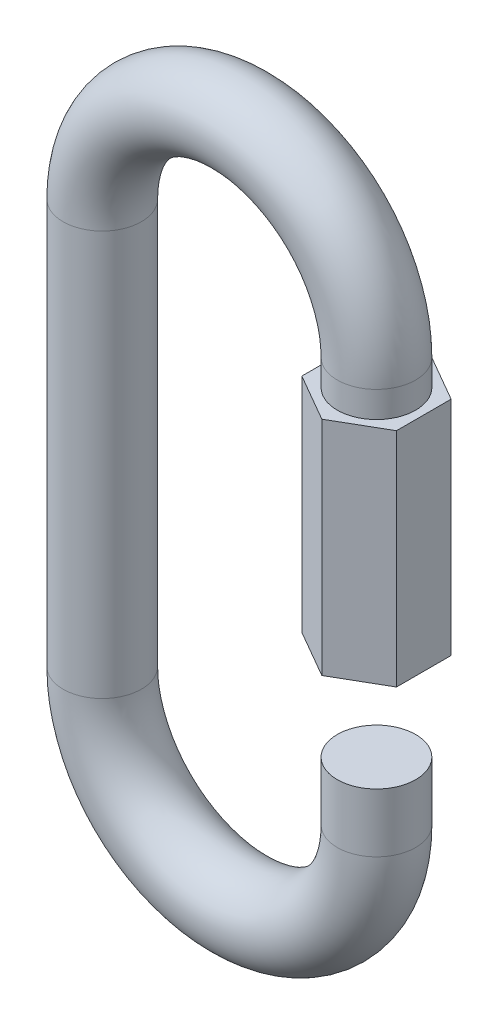
ISO-10303-21;
HEADER;
FILE_DESCRIPTION(('STEP AP214'),'2;1');
FILE_NAME('part.step','',(''),(''),'','','');
FILE_SCHEMA(('AUTOMOTIVE_DESIGN { 1 0 10303 214 1 1 1 1 }'));
ENDSEC;
DATA;
#1=APPLICATION_CONTEXT('core data for automotive mechanical design processes');
#2=APPLICATION_PROTOCOL_DEFINITION('international standard','automotive_design',2000,#1);
#3=PRODUCT_CONTEXT('',#1,'mechanical');
#4=PRODUCT('Part','Part','',(#3));
#5=PRODUCT_RELATED_PRODUCT_CATEGORY('part','',(#4));
#6=PRODUCT_DEFINITION_FORMATION('','',#4);
#7=PRODUCT_DEFINITION_CONTEXT('part definition',#1,'design');
#8=PRODUCT_DEFINITION('design','',#6,#7);
#9=PRODUCT_DEFINITION_SHAPE('','',#8);
#10=(LENGTH_UNIT() NAMED_UNIT(*) SI_UNIT(.MILLI.,.METRE.));
#11=(NAMED_UNIT(*) PLANE_ANGLE_UNIT() SI_UNIT($,.RADIAN.));
#12=(NAMED_UNIT(*) SI_UNIT($,.STERADIAN.) SOLID_ANGLE_UNIT());
#13=UNCERTAINTY_MEASURE_WITH_UNIT(LENGTH_MEASURE(1.E-05),#10,'distance_accuracy_value','');
#14=(GEOMETRIC_REPRESENTATION_CONTEXT(3) GLOBAL_UNCERTAINTY_ASSIGNED_CONTEXT((#13)) GLOBAL_UNIT_ASSIGNED_CONTEXT((#10,
#11,#12)) REPRESENTATION_CONTEXT('',''));
#15=CARTESIAN_POINT('',(0.,0.,0.));
#16=DIRECTION('',(0.,0.,1.));
#17=DIRECTION('',(1.,0.,0.));
#18=AXIS2_PLACEMENT_3D('',#15,#16,#17);
#19=CARTESIAN_POINT('',(0.,0.,0.));
#20=DIRECTION('',(0.,1.,0.));
#21=DIRECTION('',(-1.,0.,0.));
#22=AXIS2_PLACEMENT_3D('',#19,#20,#21);
#23=CYLINDRICAL_SURFACE('',#22,3.);
#24=CARTESIAN_POINT('',(0.,19.,0.));
#25=DIRECTION('',(0.,1.,0.));
#26=DIRECTION('',(0.,0.,1.));
#27=AXIS2_PLACEMENT_3D('',#24,#25,#26);
#28=CIRCLE('',#27,3.);
#29=CARTESIAN_POINT('',(2.99999999999999,19.,0.));
#30=VERTEX_POINT('',#29);
#31=EDGE_CURVE('E167',#30,#30,#28,.T.);
#32=ORIENTED_EDGE('',*,*,#31,.F.);
#33=EDGE_LOOP('',(#32));
#34=FACE_BOUND('',#33,.T.);
#35=CARTESIAN_POINT('',(0.,17.,0.));
#36=DIRECTION('',(0.,-1.,0.));
#37=DIRECTION('',(0.,0.,-1.));
#38=AXIS2_PLACEMENT_3D('',#35,#36,#37);
#39=CIRCLE('',#38,3.);
#40=CARTESIAN_POINT('',(0.,17.,-3.));
#41=VERTEX_POINT('',#40);
#42=EDGE_CURVE('E43',#41,#41,#39,.F.);
#43=ORIENTED_EDGE('',*,*,#42,.T.);
#44=EDGE_LOOP('',(#43));
#45=FACE_BOUND('',#44,.T.);
#46=ADVANCED_FACE('F39',(#34,#45),#23,.T.);
#47=CARTESIAN_POINT('',(0.,-7.5,0.));
#48=DIRECTION('',(0.,1.,0.));
#49=DIRECTION('',(0.,0.,1.));
#50=AXIS2_PLACEMENT_3D('',#47,#48,#49);
#51=PLANE('',#50);
#52=CARTESIAN_POINT('',(0.,-7.5,0.));
#53=DIRECTION('',(0.,1.,0.));
#54=DIRECTION('',(0.,0.,1.));
#55=AXIS2_PLACEMENT_3D('',#52,#53,#54);
#56=CIRCLE('',#55,3.);
#57=CARTESIAN_POINT('',(0.,-7.5,3.));
#58=VERTEX_POINT('',#57);
#59=EDGE_CURVE('E11',#58,#58,#56,.T.);
#60=ORIENTED_EDGE('',*,*,#59,.T.);
#61=EDGE_LOOP('',(#60));
#62=FACE_BOUND('',#61,.T.);
#63=ADVANCED_FACE('F200',(#62),#51,.T.);
#64=CARTESIAN_POINT('',(-10.5,19.,0.));
#65=DIRECTION('',(0.,0.,1.));
#66=DIRECTION('',(1.,0.,0.));
#67=AXIS2_PLACEMENT_3D('',#64,#65,#66);
#68=TOROIDAL_SURFACE('',#67,10.5,3.);
#69=CARTESIAN_POINT('',(-21.,19.,0.));
#70=DIRECTION('',(0.,-1.,0.));
#71=DIRECTION('',(0.,0.,1.));
#72=AXIS2_PLACEMENT_3D('',#69,#70,#71);
#73=CIRCLE('',#72,3.);
#74=CARTESIAN_POINT('',(-24.,19.,0.));
#75=VERTEX_POINT('',#74);
#76=EDGE_CURVE('E171',#75,#75,#73,.T.);
#77=CARTESIAN_POINT('',(-10.5,19.,0.));
#78=DIRECTION('',(0.,0.,1.));
#79=DIRECTION('',(1.,0.,0.));
#80=AXIS2_PLACEMENT_3D('',#77,#78,#79);
#81=CIRCLE('',#80,13.5);
#82=EDGE_CURVE('',#30,#75,#81,.T.);
#83=ORIENTED_EDGE('',*,*,#31,.T.);
#84=ORIENTED_EDGE('',*,*,#76,.F.);
#85=ORIENTED_EDGE('',*,*,#82,.T.);
#86=ORIENTED_EDGE('',*,*,#82,.F.);
#87=EDGE_LOOP('',(#83,#85,#84,#86));
#88=FACE_BOUND('',#87,.T.);
#89=ADVANCED_FACE('F194',(#88),#68,.T.);
#90=CARTESIAN_POINT('',(-21.,19.,0.));
#91=DIRECTION('',(0.,-1.,0.));
#92=DIRECTION('',(1.,0.,0.));
#93=AXIS2_PLACEMENT_3D('',#90,#91,#92);
#94=CYLINDRICAL_SURFACE('',#93,3.);
#95=CARTESIAN_POINT('',(-21.,-12.,0.));
#96=DIRECTION('',(0.,-1.,0.));
#97=DIRECTION('',(0.,0.,1.));
#98=AXIS2_PLACEMENT_3D('',#95,#96,#97);
#99=CIRCLE('',#98,3.);
#100=CARTESIAN_POINT('',(-24.,-12.,0.));
#101=VERTEX_POINT('',#100);
#102=EDGE_CURVE('E175',#101,#101,#99,.T.);
#103=ORIENTED_EDGE('',*,*,#102,.F.);
#104=EDGE_LOOP('',(#103));
#105=FACE_BOUND('',#104,.T.);
#106=ORIENTED_EDGE('',*,*,#76,.T.);
#107=EDGE_LOOP('',(#106));
#108=FACE_BOUND('',#107,.T.);
#109=ADVANCED_FACE('F188',(#105,#108),#94,.T.);
#110=CARTESIAN_POINT('',(-10.5,-12.,0.));
#111=DIRECTION('',(0.,0.,1.));
#112=DIRECTION('',(1.,0.,0.));
#113=AXIS2_PLACEMENT_3D('',#110,#111,#112);
#114=TOROIDAL_SURFACE('',#113,10.5,3.);
#115=CARTESIAN_POINT('',(0.,-12.,0.));
#116=DIRECTION('',(0.,1.,0.));
#117=DIRECTION('',(0.,0.,1.));
#118=AXIS2_PLACEMENT_3D('',#115,#116,#117);
#119=CIRCLE('',#118,3.);
#120=CARTESIAN_POINT('',(3.00000000000002,-12.,0.));
#121=VERTEX_POINT('',#120);
#122=EDGE_CURVE('E50',#121,#121,#119,.T.);
#123=CARTESIAN_POINT('',(-10.5,-12.,0.));
#124=DIRECTION('',(0.,0.,1.));
#125=DIRECTION('',(1.,0.,0.));
#126=AXIS2_PLACEMENT_3D('',#123,#124,#125);
#127=CIRCLE('',#126,13.5);
#128=EDGE_CURVE('',#101,#121,#127,.T.);
#129=ORIENTED_EDGE('',*,*,#102,.T.);
#130=ORIENTED_EDGE('',*,*,#122,.F.);
#131=ORIENTED_EDGE('',*,*,#128,.T.);
#132=ORIENTED_EDGE('',*,*,#128,.F.);
#133=EDGE_LOOP('',(#129,#131,#130,#132));
#134=FACE_BOUND('',#133,.T.);
#135=ADVANCED_FACE('F185',(#134),#114,.T.);
#136=CARTESIAN_POINT('',(0.,-12.,0.));
#137=DIRECTION('',(0.,1.,0.));
#138=DIRECTION('',(-1.,0.,0.));
#139=AXIS2_PLACEMENT_3D('',#136,#137,#138);
#140=CYLINDRICAL_SURFACE('',#139,3.);
#141=ORIENTED_EDGE('',*,*,#59,.F.);
#142=EDGE_LOOP('',(#141));
#143=FACE_BOUND('',#142,.T.);
#144=ORIENTED_EDGE('',*,*,#122,.T.);
#145=EDGE_LOOP('',(#144));
#146=FACE_BOUND('',#145,.T.);
#147=ADVANCED_FACE('F183',(#143,#146),#140,.T.);
#148=CARTESIAN_POINT('',(3.62330407200812,17.,-2.09191558132975));
#149=DIRECTION('',(1.,0.,0.));
#150=DIRECTION('',(0.,0.,-1.));
#151=AXIS2_PLACEMENT_3D('',#148,#149,#150);
#152=PLANE('',#151);
#153=DIRECTION('',(0.,0.,1.));
#154=VECTOR('',#153,1.);
#155=CARTESIAN_POINT('',(3.62330407200812,0.,-2.09191558132975));
#156=LINE('',#155,#154);
#157=CARTESIAN_POINT('',(3.62330407200812,0.,-2.09191558132975));
#158=VERTEX_POINT('',#157);
#159=CARTESIAN_POINT('',(3.62330407200812,0.,2.09191558132975));
#160=VERTEX_POINT('',#159);
#161=EDGE_CURVE('E134',#158,#160,#156,.T.);
#162=ORIENTED_EDGE('',*,*,#161,.F.);
#163=DIRECTION('',(0.,-1.,0.));
#164=VECTOR('',#163,1.);
#165=CARTESIAN_POINT('',(3.62330407200812,17.,-2.09191558132975));
#166=LINE('',#165,#164);
#167=CARTESIAN_POINT('',(3.62330407200812,17.,-2.09191558132975));
#168=VERTEX_POINT('',#167);
#169=EDGE_CURVE('E58',#168,#158,#166,.T.);
#170=ORIENTED_EDGE('',*,*,#169,.F.);
#171=DIRECTION('',(0.,0.,1.));
#172=VECTOR('',#171,1.);
#173=CARTESIAN_POINT('',(3.62330407200812,17.,-2.09191558132975));
#174=LINE('',#173,#172);
#175=CARTESIAN_POINT('',(3.62330407200812,17.,2.09191558132975));
#176=VERTEX_POINT('',#175);
#177=EDGE_CURVE('E155',#168,#176,#174,.T.);
#178=ORIENTED_EDGE('',*,*,#177,.T.);
#179=DIRECTION('',(0.,-1.,0.));
#180=VECTOR('',#179,1.);
#181=CARTESIAN_POINT('',(3.62330407200812,17.,2.09191558132975));
#182=LINE('',#181,#180);
#183=EDGE_CURVE('E93',#176,#160,#182,.T.);
#184=ORIENTED_EDGE('',*,*,#183,.T.);
#185=EDGE_LOOP('',(#162,#170,#178,#184));
#186=FACE_BOUND('',#185,.T.);
#187=ADVANCED_FACE('F225',(#186),#152,.T.);
#188=CARTESIAN_POINT('',(0.,17.,-4.18383116265951));
#189=DIRECTION('',(0.5,0.,-0.866025403784439));
#190=DIRECTION('',(-0.866025403784439,0.,-0.5));
#191=AXIS2_PLACEMENT_3D('',#188,#189,#190);
#192=PLANE('',#191);
#193=DIRECTION('',(0.866025403784439,0.,0.5));
#194=VECTOR('',#193,1.);
#195=CARTESIAN_POINT('',(0.,0.,-4.18383116265951));
#196=LINE('',#195,#194);
#197=CARTESIAN_POINT('',(0.,0.,-4.18383116265951));
#198=VERTEX_POINT('',#197);
#199=EDGE_CURVE('E151',#198,#158,#196,.T.);
#200=ORIENTED_EDGE('',*,*,#199,.F.);
#201=DIRECTION('',(0.,-1.,0.));
#202=VECTOR('',#201,1.);
#203=CARTESIAN_POINT('',(0.,17.,-4.18383116265951));
#204=LINE('',#203,#202);
#205=CARTESIAN_POINT('',(0.,17.,-4.18383116265951));
#206=VERTEX_POINT('',#205);
#207=EDGE_CURVE('E81',#206,#198,#204,.T.);
#208=ORIENTED_EDGE('',*,*,#207,.F.);
#209=DIRECTION('',(0.866025403784439,0.,0.5));
#210=VECTOR('',#209,1.);
#211=CARTESIAN_POINT('',(0.,17.,-4.18383116265951));
#212=LINE('',#211,#210);
#213=EDGE_CURVE('E120',#206,#168,#212,.T.);
#214=ORIENTED_EDGE('',*,*,#213,.T.);
#215=ORIENTED_EDGE('',*,*,#169,.T.);
#216=EDGE_LOOP('',(#200,#208,#214,#215));
#217=FACE_BOUND('',#216,.T.);
#218=ADVANCED_FACE('F222',(#217),#192,.T.);
#219=CARTESIAN_POINT('',(-3.62330407200812,17.,-2.09191558132975));
#220=DIRECTION('',(-0.5,0.,-0.866025403784439));
#221=DIRECTION('',(-0.866025403784439,0.,0.5));
#222=AXIS2_PLACEMENT_3D('',#219,#220,#221);
#223=PLANE('',#222);
#224=DIRECTION('',(0.866025403784439,0.,-0.5));
#225=VECTOR('',#224,1.);
#226=CARTESIAN_POINT('',(-3.62330407200812,0.,-2.09191558132975));
#227=LINE('',#226,#225);
#228=CARTESIAN_POINT('',(-3.62330407200812,0.,-2.09191558132975));
#229=VERTEX_POINT('',#228);
#230=EDGE_CURVE('E106',#229,#198,#227,.T.);
#231=ORIENTED_EDGE('',*,*,#230,.F.);
#232=DIRECTION('',(0.,-1.,0.));
#233=VECTOR('',#232,1.);
#234=CARTESIAN_POINT('',(-3.62330407200812,17.,-2.09191558132975));
#235=LINE('',#234,#233);
#236=CARTESIAN_POINT('',(-3.62330407200812,17.,-2.09191558132975));
#237=VERTEX_POINT('',#236);
#238=EDGE_CURVE('E101',#237,#229,#235,.T.);
#239=ORIENTED_EDGE('',*,*,#238,.F.);
#240=DIRECTION('',(0.866025403784439,0.,-0.5));
#241=VECTOR('',#240,1.);
#242=CARTESIAN_POINT('',(-3.62330407200812,17.,-2.09191558132975));
#243=LINE('',#242,#241);
#244=EDGE_CURVE('E104',#237,#206,#243,.T.);
#245=ORIENTED_EDGE('',*,*,#244,.T.);
#246=ORIENTED_EDGE('',*,*,#207,.T.);
#247=EDGE_LOOP('',(#231,#239,#245,#246));
#248=FACE_BOUND('',#247,.T.);
#249=ADVANCED_FACE('F103',(#248),#223,.T.);
#250=CARTESIAN_POINT('',(-3.62330407200812,17.,2.09191558132976));
#251=DIRECTION('',(-1.,0.,0.));
#252=DIRECTION('',(0.,0.,1.));
#253=AXIS2_PLACEMENT_3D('',#250,#251,#252);
#254=PLANE('',#253);
#255=DIRECTION('',(0.,0.,-1.));
#256=VECTOR('',#255,1.);
#257=CARTESIAN_POINT('',(-3.62330407200812,0.,2.09191558132976));
#258=LINE('',#257,#256);
#259=CARTESIAN_POINT('',(-3.62330407200812,0.,2.09191558132976));
#260=VERTEX_POINT('',#259);
#261=EDGE_CURVE('E146',#260,#229,#258,.T.);
#262=ORIENTED_EDGE('',*,*,#261,.F.);
#263=DIRECTION('',(0.,-1.,0.));
#264=VECTOR('',#263,1.);
#265=CARTESIAN_POINT('',(-3.62330407200812,17.,2.09191558132976));
#266=LINE('',#265,#264);
#267=CARTESIAN_POINT('',(-3.62330407200812,17.,2.09191558132976));
#268=VERTEX_POINT('',#267);
#269=EDGE_CURVE('E112',#268,#260,#266,.T.);
#270=ORIENTED_EDGE('',*,*,#269,.F.);
#271=DIRECTION('',(0.,0.,-1.));
#272=VECTOR('',#271,1.);
#273=CARTESIAN_POINT('',(-3.62330407200812,17.,2.09191558132976));
#274=LINE('',#273,#272);
#275=EDGE_CURVE('E118',#268,#237,#274,.T.);
#276=ORIENTED_EDGE('',*,*,#275,.T.);
#277=ORIENTED_EDGE('',*,*,#238,.T.);
#278=EDGE_LOOP('',(#262,#270,#276,#277));
#279=FACE_BOUND('',#278,.T.);
#280=ADVANCED_FACE('F123',(#279),#254,.T.);
#281=CARTESIAN_POINT('',(0.,17.,4.18383116265951));
#282=DIRECTION('',(-0.5,0.,0.866025403784439));
#283=DIRECTION('',(0.866025403784439,0.,0.5));
#284=AXIS2_PLACEMENT_3D('',#281,#282,#283);
#285=PLANE('',#284);
#286=DIRECTION('',(-0.866025403784439,0.,-0.5));
#287=VECTOR('',#286,1.);
#288=CARTESIAN_POINT('',(0.,0.,4.18383116265951));
#289=LINE('',#288,#287);
#290=CARTESIAN_POINT('',(0.,0.,4.18383116265951));
#291=VERTEX_POINT('',#290);
#292=EDGE_CURVE('E142',#291,#260,#289,.T.);
#293=ORIENTED_EDGE('',*,*,#292,.F.);
#294=DIRECTION('',(0.,-1.,0.));
#295=VECTOR('',#294,1.);
#296=CARTESIAN_POINT('',(0.,17.,4.18383116265951));
#297=LINE('',#296,#295);
#298=CARTESIAN_POINT('',(0.,17.,4.18383116265951));
#299=VERTEX_POINT('',#298);
#300=EDGE_CURVE('E162',#299,#291,#297,.T.);
#301=ORIENTED_EDGE('',*,*,#300,.F.);
#302=DIRECTION('',(-0.866025403784439,0.,-0.5));
#303=VECTOR('',#302,1.);
#304=CARTESIAN_POINT('',(0.,17.,4.18383116265951));
#305=LINE('',#304,#303);
#306=EDGE_CURVE('E125',#299,#268,#305,.T.);
#307=ORIENTED_EDGE('',*,*,#306,.T.);
#308=ORIENTED_EDGE('',*,*,#269,.T.);
#309=EDGE_LOOP('',(#293,#301,#307,#308));
#310=FACE_BOUND('',#309,.T.);
#311=ADVANCED_FACE('F219',(#310),#285,.T.);
#312=CARTESIAN_POINT('',(3.62330407200812,17.,2.09191558132975));
#313=DIRECTION('',(0.5,0.,0.866025403784439));
#314=DIRECTION('',(0.866025403784439,0.,-0.5));
#315=AXIS2_PLACEMENT_3D('',#312,#313,#314);
#316=PLANE('',#315);
#317=DIRECTION('',(-0.866025403784439,0.,0.5));
#318=VECTOR('',#317,1.);
#319=CARTESIAN_POINT('',(3.62330407200812,0.,2.09191558132975));
#320=LINE('',#319,#318);
#321=EDGE_CURVE('E138',#160,#291,#320,.T.);
#322=ORIENTED_EDGE('',*,*,#321,.F.);
#323=ORIENTED_EDGE('',*,*,#183,.F.);
#324=DIRECTION('',(-0.866025403784439,0.,0.5));
#325=VECTOR('',#324,1.);
#326=CARTESIAN_POINT('',(3.62330407200812,17.,2.09191558132975));
#327=LINE('',#326,#325);
#328=EDGE_CURVE('E128',#176,#299,#327,.T.);
#329=ORIENTED_EDGE('',*,*,#328,.T.);
#330=ORIENTED_EDGE('',*,*,#300,.T.);
#331=EDGE_LOOP('',(#322,#323,#329,#330));
#332=FACE_BOUND('',#331,.T.);
#333=ADVANCED_FACE('F212',(#332),#316,.T.);
#334=CARTESIAN_POINT('',(0.,17.,0.));
#335=DIRECTION('',(0.,-1.,0.));
#336=DIRECTION('',(0.,0.,-1.));
#337=AXIS2_PLACEMENT_3D('',#334,#335,#336);
#338=PLANE('',#337);
#339=ORIENTED_EDGE('',*,*,#42,.F.);
#340=EDGE_LOOP('',(#339));
#341=FACE_BOUND('',#340,.T.);
#342=ORIENTED_EDGE('',*,*,#177,.F.);
#343=ORIENTED_EDGE('',*,*,#213,.F.);
#344=ORIENTED_EDGE('',*,*,#244,.F.);
#345=ORIENTED_EDGE('',*,*,#275,.F.);
#346=ORIENTED_EDGE('',*,*,#306,.F.);
#347=ORIENTED_EDGE('',*,*,#328,.F.);
#348=EDGE_LOOP('',(#342,#343,#344,#345,#346,#347));
#349=FACE_BOUND('',#348,.T.);
#350=ADVANCED_FACE('F116',(#341,#349),#338,.F.);
#351=CARTESIAN_POINT('',(0.,0.,0.));
#352=DIRECTION('',(0.,1.,0.));
#353=DIRECTION('',(0.,0.,1.));
#354=AXIS2_PLACEMENT_3D('',#351,#352,#353);
#355=PLANE('',#354);
#356=ORIENTED_EDGE('',*,*,#161,.T.);
#357=ORIENTED_EDGE('',*,*,#321,.T.);
#358=ORIENTED_EDGE('',*,*,#292,.T.);
#359=ORIENTED_EDGE('',*,*,#261,.T.);
#360=ORIENTED_EDGE('',*,*,#230,.T.);
#361=ORIENTED_EDGE('',*,*,#199,.T.);
#362=EDGE_LOOP('',(#356,#357,#358,#359,#360,#361));
#363=FACE_BOUND('',#362,.T.);
#364=ADVANCED_FACE('F41',(#363),#355,.F.);
#365=CLOSED_SHELL('',(#46,#63,#89,#109,#135,#147,#187,#218,#249,#280,#311,#333,#350,#364));
#366=MANIFOLD_SOLID_BREP('B2',#365);
#367=ADVANCED_BREP_SHAPE_REPRESENTATION('',(#18,#366),#14);
#368=SHAPE_DEFINITION_REPRESENTATION(#9,#367);
ENDSEC;
END-ISO-10303-21;
